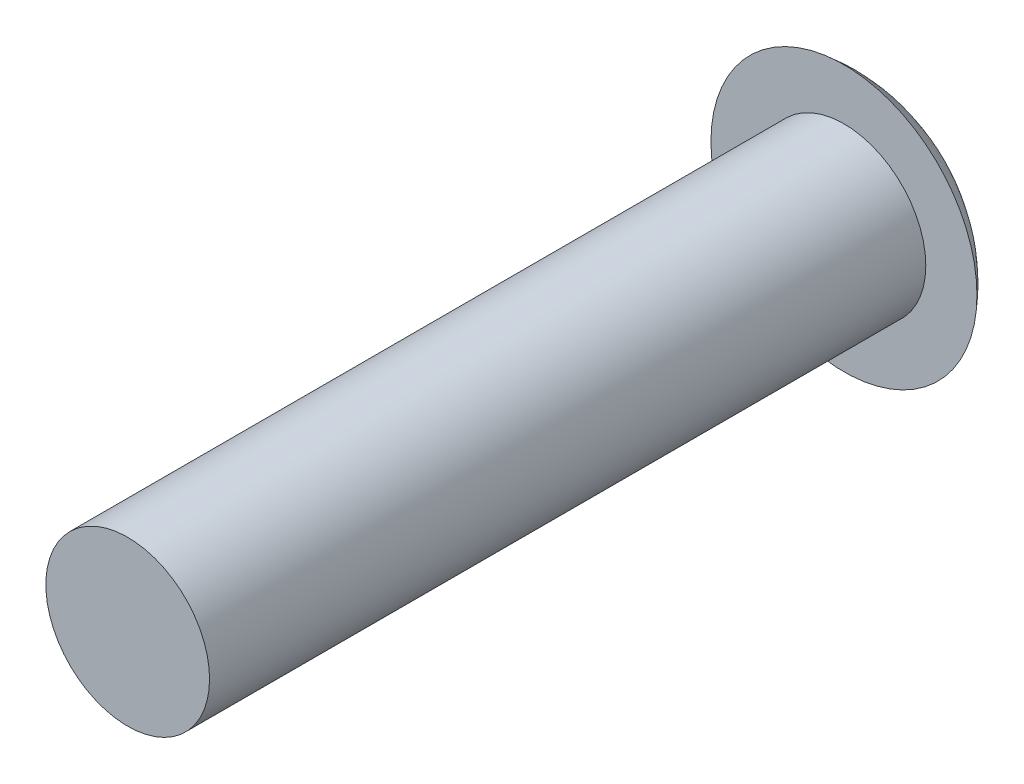
ISO-10303-21;
HEADER;
FILE_DESCRIPTION(('STEP AP214'),'2;1');
FILE_NAME('part.step','',(''),(''),'','','');
FILE_SCHEMA(('AUTOMOTIVE_DESIGN { 1 0 10303 214 1 1 1 1 }'));
ENDSEC;
DATA;
#1=APPLICATION_CONTEXT('core data for automotive mechanical design processes');
#2=APPLICATION_PROTOCOL_DEFINITION('international standard','automotive_design',2000,#1);
#3=PRODUCT_CONTEXT('',#1,'mechanical');
#4=PRODUCT('Part','Part','',(#3));
#5=PRODUCT_RELATED_PRODUCT_CATEGORY('part','',(#4));
#6=PRODUCT_DEFINITION_FORMATION('','',#4);
#7=PRODUCT_DEFINITION_CONTEXT('part definition',#1,'design');
#8=PRODUCT_DEFINITION('design','',#6,#7);
#9=PRODUCT_DEFINITION_SHAPE('','',#8);
#10=(LENGTH_UNIT() NAMED_UNIT(*) SI_UNIT(.MILLI.,.METRE.));
#11=(NAMED_UNIT(*) PLANE_ANGLE_UNIT() SI_UNIT($,.RADIAN.));
#12=(NAMED_UNIT(*) SI_UNIT($,.STERADIAN.) SOLID_ANGLE_UNIT());
#13=UNCERTAINTY_MEASURE_WITH_UNIT(LENGTH_MEASURE(1.E-05),#10,'distance_accuracy_value','');
#14=(GEOMETRIC_REPRESENTATION_CONTEXT(3) GLOBAL_UNCERTAINTY_ASSIGNED_CONTEXT((#13)) GLOBAL_UNIT_ASSIGNED_CONTEXT((#10,
#11,#12)) REPRESENTATION_CONTEXT('',''));
#15=CARTESIAN_POINT('',(0.,0.,0.));
#16=DIRECTION('',(0.,0.,1.));
#17=DIRECTION('',(1.,0.,0.));
#18=AXIS2_PLACEMENT_3D('',#15,#16,#17);
#19=CARTESIAN_POINT('',(0.,0.,0.));
#20=DIRECTION('',(0.,0.,-1.));
#21=DIRECTION('',(-1.,0.,0.));
#22=AXIS2_PLACEMENT_3D('',#19,#20,#21);
#23=PLANE('',#22);
#24=CARTESIAN_POINT('',(0.,0.,0.));
#25=DIRECTION('',(0.,0.,1.));
#26=DIRECTION('',(1.,0.,0.));
#27=AXIS2_PLACEMENT_3D('',#24,#25,#26);
#28=CIRCLE('',#27,1.6);
#29=CARTESIAN_POINT('',(1.6,0.,0.));
#30=VERTEX_POINT('',#29);
#31=EDGE_CURVE('E10',#30,#30,#28,.T.);
#32=ORIENTED_EDGE('',*,*,#31,.T.);
#33=EDGE_LOOP('',(#32));
#34=FACE_BOUND('',#33,.T.);
#35=ADVANCED_FACE('F37',(#34),#23,.F.);
#36=CARTESIAN_POINT('',(0.,0.,0.));
#37=DIRECTION('',(0.,0.,1.));
#38=DIRECTION('',(1.,0.,0.));
#39=AXIS2_PLACEMENT_3D('',#36,#37,#38);
#40=CYLINDRICAL_SURFACE('',#39,1.6);
#41=ORIENTED_EDGE('',*,*,#31,.F.);
#42=EDGE_LOOP('',(#41));
#43=FACE_BOUND('',#42,.T.);
#44=CARTESIAN_POINT('',(0.,0.,-14.));
#45=DIRECTION('',(0.,0.,1.));
#46=DIRECTION('',(1.,0.,0.));
#47=AXIS2_PLACEMENT_3D('',#44,#45,#46);
#48=CIRCLE('',#47,1.6);
#49=CARTESIAN_POINT('',(1.6,0.,-14.));
#50=VERTEX_POINT('',#49);
#51=EDGE_CURVE('E44',#50,#50,#48,.T.);
#52=ORIENTED_EDGE('',*,*,#51,.T.);
#53=EDGE_LOOP('',(#52));
#54=FACE_BOUND('',#53,.T.);
#55=ADVANCED_FACE('F73',(#43,#54),#40,.T.);
#56=CARTESIAN_POINT('',(-1.6,0.,-14.));
#57=DIRECTION('',(0.,0.,-1.));
#58=DIRECTION('',(-1.,0.,0.));
#59=AXIS2_PLACEMENT_3D('',#56,#57,#58);
#60=PLANE('',#59);
#61=ORIENTED_EDGE('',*,*,#51,.F.);
#62=EDGE_LOOP('',(#61));
#63=FACE_BOUND('',#62,.T.);
#64=CARTESIAN_POINT('',(0.,0.,-14.));
#65=DIRECTION('',(0.,0.,1.));
#66=DIRECTION('',(1.,0.,0.));
#67=AXIS2_PLACEMENT_3D('',#64,#65,#66);
#68=CIRCLE('',#67,2.6);
#69=CARTESIAN_POINT('',(2.6,0.,-14.));
#70=VERTEX_POINT('',#69);
#71=EDGE_CURVE('E49',#70,#70,#68,.T.);
#72=ORIENTED_EDGE('',*,*,#71,.T.);
#73=EDGE_LOOP('',(#72));
#74=FACE_BOUND('',#73,.T.);
#75=ADVANCED_FACE('F69',(#63,#74),#60,.F.);
#76=CARTESIAN_POINT('',(0.,0.,-12.295));
#77=DIRECTION('',(0.,0.,1.));
#78=DIRECTION('',(1.,0.,0.));
#79=AXIS2_PLACEMENT_3D('',#76,#77,#78);
#80=DEGENERATE_TOROIDAL_SURFACE('',#79,0.500000000000004,2.70499999999999,.T.);
#81=ORIENTED_EDGE('',*,*,#71,.F.);
#82=EDGE_LOOP('',(#81));
#83=FACE_BOUND('',#82,.T.);
#84=CARTESIAN_POINT('',(0.,0.,-15.));
#85=DIRECTION('',(0.,0.,1.));
#86=DIRECTION('',(1.,0.,0.));
#87=AXIS2_PLACEMENT_3D('',#84,#85,#86);
#88=CIRCLE('',#87,0.500000000000004);
#89=CARTESIAN_POINT('',(0.500000000000004,0.,-15.));
#90=VERTEX_POINT('',#89);
#91=EDGE_CURVE('E54',#90,#90,#88,.T.);
#92=ORIENTED_EDGE('',*,*,#91,.T.);
#93=EDGE_LOOP('',(#92));
#94=FACE_BOUND('',#93,.T.);
#95=ADVANCED_FACE('F61',(#83,#94),#80,.T.);
#96=CARTESIAN_POINT('',(0.,0.,-15.));
#97=DIRECTION('',(0.,0.,1.));
#98=DIRECTION('',(1.,0.,0.));
#99=AXIS2_PLACEMENT_3D('',#96,#97,#98);
#100=PLANE('',#99);
#101=ORIENTED_EDGE('',*,*,#91,.F.);
#102=EDGE_LOOP('',(#101));
#103=FACE_BOUND('',#102,.T.);
#104=ADVANCED_FACE('F63',(#103),#100,.F.);
#105=CLOSED_SHELL('',(#35,#55,#75,#95,#104));
#106=MANIFOLD_SOLID_BREP('B2',#105);
#107=ADVANCED_BREP_SHAPE_REPRESENTATION('',(#18,#106),#14);
#108=SHAPE_DEFINITION_REPRESENTATION(#9,#107);
ENDSEC;
END-ISO-10303-21;
